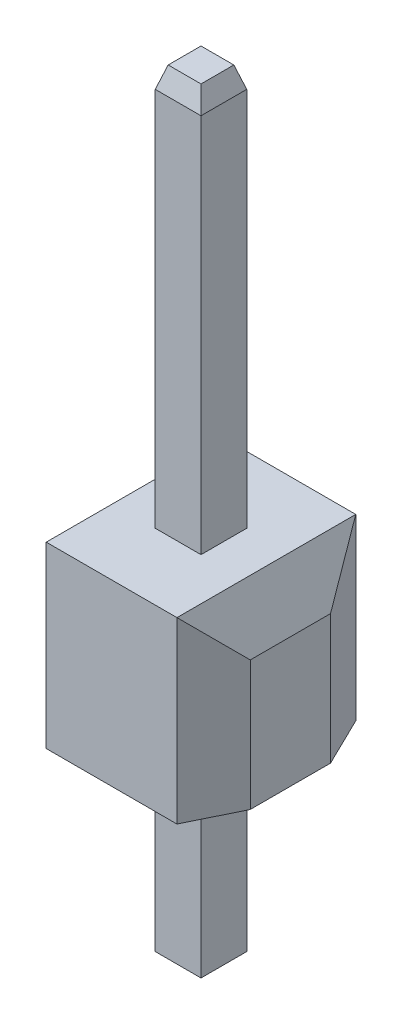
ISO-10303-21;
HEADER;
FILE_DESCRIPTION(('STEP AP214'),'2;1');
FILE_NAME('part.step','',(''),(''),'','','');
FILE_SCHEMA(('AUTOMOTIVE_DESIGN { 1 0 10303 214 1 1 1 1 }'));
ENDSEC;
DATA;
#1=APPLICATION_CONTEXT('core data for automotive mechanical design processes');
#2=APPLICATION_PROTOCOL_DEFINITION('international standard','automotive_design',2000,#1);
#3=PRODUCT_CONTEXT('',#1,'mechanical');
#4=PRODUCT('Part','Part','',(#3));
#5=PRODUCT_RELATED_PRODUCT_CATEGORY('part','',(#4));
#6=PRODUCT_DEFINITION_FORMATION('','',#4);
#7=PRODUCT_DEFINITION_CONTEXT('part definition',#1,'design');
#8=PRODUCT_DEFINITION('design','',#6,#7);
#9=PRODUCT_DEFINITION_SHAPE('','',#8);
#10=(LENGTH_UNIT() NAMED_UNIT(*) SI_UNIT(.MILLI.,.METRE.));
#11=(NAMED_UNIT(*) PLANE_ANGLE_UNIT() SI_UNIT($,.RADIAN.));
#12=(NAMED_UNIT(*) SI_UNIT($,.STERADIAN.) SOLID_ANGLE_UNIT());
#13=UNCERTAINTY_MEASURE_WITH_UNIT(LENGTH_MEASURE(1.E-05),#10,'distance_accuracy_value','');
#14=(GEOMETRIC_REPRESENTATION_CONTEXT(3) GLOBAL_UNCERTAINTY_ASSIGNED_CONTEXT((#13)) GLOBAL_UNIT_ASSIGNED_CONTEXT((#10,
#11,#12)) REPRESENTATION_CONTEXT('',''));
#15=CARTESIAN_POINT('',(0.,0.,0.));
#16=DIRECTION('',(0.,0.,1.));
#17=DIRECTION('',(1.,0.,0.));
#18=AXIS2_PLACEMENT_3D('',#15,#16,#17);
#19=CARTESIAN_POINT('',(0.,8.24,-0.233280795562401));
#20=DIRECTION('',(0.,-0.292371704722734,0.956304755963036));
#21=DIRECTION('',(0.,-0.956304755963036,-0.292371704722734));
#22=AXIS2_PLACEMENT_3D('',#19,#20,#21);
#23=PLANE('',#22);
#24=DIRECTION('',(-1.,0.,0.));
#25=VECTOR('',#24,1.);
#26=CARTESIAN_POINT('',(0.325,7.94,-0.325));
#27=LINE('',#26,#25);
#28=CARTESIAN_POINT('',(-0.325,7.94,-0.325));
#29=VERTEX_POINT('',#28);
#30=CARTESIAN_POINT('',(0.325,7.94,-0.325));
#31=VERTEX_POINT('',#30);
#32=EDGE_CURVE('E177',#29,#31,#27,.F.);
#33=ORIENTED_EDGE('',*,*,#32,.F.);
#34=DIRECTION('',(0.280623595142125,0.917878420979062,0.280623595142126));
#35=VECTOR('',#34,1.);
#36=CARTESIAN_POINT('',(-0.325,7.94,-0.325));
#37=LINE('',#36,#35);
#38=CARTESIAN_POINT('',(-0.233280795562401,8.24,-0.233280795562401));
#39=VERTEX_POINT('',#38);
#40=EDGE_CURVE('E152',#29,#39,#37,.T.);
#41=ORIENTED_EDGE('',*,*,#40,.T.);
#42=DIRECTION('',(1.,0.,0.));
#43=VECTOR('',#42,1.);
#44=CARTESIAN_POINT('',(0.,8.24,-0.233280795562401));
#45=LINE('',#44,#43);
#46=CARTESIAN_POINT('',(0.233280795562401,8.24,-0.233280795562401));
#47=VERTEX_POINT('',#46);
#48=EDGE_CURVE('E20',#47,#39,#45,.F.);
#49=ORIENTED_EDGE('',*,*,#48,.F.);
#50=DIRECTION('',(0.280623595142125,-0.917878420979062,-0.280623595142126));
#51=VECTOR('',#50,1.);
#52=CARTESIAN_POINT('',(0.233280795562401,8.24,-0.233280795562401));
#53=LINE('',#52,#51);
#54=EDGE_CURVE('E156',#47,#31,#53,.T.);
#55=ORIENTED_EDGE('',*,*,#54,.T.);
#56=EDGE_LOOP('',(#33,#41,#49,#55));
#57=FACE_BOUND('',#56,.T.);
#58=ADVANCED_FACE('F17',(#57),#23,.F.);
#59=CARTESIAN_POINT('',(0.,8.24,0.));
#60=DIRECTION('',(0.,1.,0.));
#61=DIRECTION('',(0.,0.,1.));
#62=AXIS2_PLACEMENT_3D('',#59,#60,#61);
#63=PLANE('',#62);
#64=DIRECTION('',(0.,0.,1.));
#65=VECTOR('',#64,1.);
#66=CARTESIAN_POINT('',(-0.233280795562401,8.24,0.));
#67=LINE('',#66,#65);
#68=CARTESIAN_POINT('',(-0.233280795562401,8.24,0.233280795562401));
#69=VERTEX_POINT('',#68);
#70=EDGE_CURVE('E173',#39,#69,#67,.T.);
#71=ORIENTED_EDGE('',*,*,#70,.T.);
#72=DIRECTION('',(1.,0.,0.));
#73=VECTOR('',#72,1.);
#74=CARTESIAN_POINT('',(0.,8.24,0.233280795562401));
#75=LINE('',#74,#73);
#76=CARTESIAN_POINT('',(0.233280795562401,8.24,0.233280795562401));
#77=VERTEX_POINT('',#76);
#78=EDGE_CURVE('E164',#69,#77,#75,.T.);
#79=ORIENTED_EDGE('',*,*,#78,.T.);
#80=DIRECTION('',(0.,0.,1.));
#81=VECTOR('',#80,1.);
#82=CARTESIAN_POINT('',(0.233280795562401,8.24,0.));
#83=LINE('',#82,#81);
#84=EDGE_CURVE('E160',#77,#47,#83,.F.);
#85=ORIENTED_EDGE('',*,*,#84,.T.);
#86=ORIENTED_EDGE('',*,*,#48,.T.);
#87=EDGE_LOOP('',(#71,#79,#85,#86));
#88=FACE_BOUND('',#87,.T.);
#89=ADVANCED_FACE('F162',(#88),#63,.T.);
#90=CARTESIAN_POINT('',(0.233280795562401,8.24,0.));
#91=DIRECTION('',(-0.956304755963036,-0.292371704722734,0.));
#92=DIRECTION('',(0.292371704722734,-0.956304755963036,0.));
#93=AXIS2_PLACEMENT_3D('',#90,#91,#92);
#94=PLANE('',#93);
#95=DIRECTION('',(0.,0.,-1.));
#96=VECTOR('',#95,1.);
#97=CARTESIAN_POINT('',(0.325,7.94,0.325));
#98=LINE('',#97,#96);
#99=CARTESIAN_POINT('',(0.325,7.94,0.325));
#100=VERTEX_POINT('',#99);
#101=EDGE_CURVE('E170',#31,#100,#98,.F.);
#102=ORIENTED_EDGE('',*,*,#101,.F.);
#103=ORIENTED_EDGE('',*,*,#54,.F.);
#104=ORIENTED_EDGE('',*,*,#84,.F.);
#105=DIRECTION('',(0.280623595142126,-0.917878420979062,0.280623595142125));
#106=VECTOR('',#105,1.);
#107=CARTESIAN_POINT('',(0.233280795562401,8.24,0.233280795562401));
#108=LINE('',#107,#106);
#109=EDGE_CURVE('E188',#77,#100,#108,.T.);
#110=ORIENTED_EDGE('',*,*,#109,.T.);
#111=EDGE_LOOP('',(#102,#103,#104,#110));
#112=FACE_BOUND('',#111,.T.);
#113=ADVANCED_FACE('F168',(#112),#94,.F.);
#114=CARTESIAN_POINT('',(-0.233280795562401,8.24,0.));
#115=DIRECTION('',(0.956304755963036,-0.292371704722734,0.));
#116=DIRECTION('',(0.292371704722734,0.956304755963036,0.));
#117=AXIS2_PLACEMENT_3D('',#114,#115,#116);
#118=PLANE('',#117);
#119=ORIENTED_EDGE('',*,*,#70,.F.);
#120=ORIENTED_EDGE('',*,*,#40,.F.);
#121=DIRECTION('',(0.,0.,1.));
#122=VECTOR('',#121,1.);
#123=CARTESIAN_POINT('',(-0.325,7.94,0.325));
#124=LINE('',#123,#122);
#125=CARTESIAN_POINT('',(-0.325,7.94,0.325));
#126=VERTEX_POINT('',#125);
#127=EDGE_CURVE('E193',#126,#29,#124,.F.);
#128=ORIENTED_EDGE('',*,*,#127,.F.);
#129=DIRECTION('',(0.280623595142126,0.917878420979062,-0.280623595142126));
#130=VECTOR('',#129,1.);
#131=CARTESIAN_POINT('',(-0.325,7.94,0.325));
#132=LINE('',#131,#130);
#133=EDGE_CURVE('E190',#126,#69,#132,.T.);
#134=ORIENTED_EDGE('',*,*,#133,.T.);
#135=EDGE_LOOP('',(#119,#120,#128,#134));
#136=FACE_BOUND('',#135,.T.);
#137=ADVANCED_FACE('F629',(#136),#118,.F.);
#138=CARTESIAN_POINT('',(0.325,-2.76,-0.325));
#139=DIRECTION('',(0.,0.,-1.));
#140=DIRECTION('',(-1.,0.,0.));
#141=AXIS2_PLACEMENT_3D('',#138,#139,#140);
#142=PLANE('',#141);
#143=DIRECTION('',(0.,1.,0.));
#144=VECTOR('',#143,1.);
#145=CARTESIAN_POINT('',(0.325,-2.76,-0.325));
#146=LINE('',#145,#144);
#147=CARTESIAN_POINT('',(0.325,2.54,-0.325));
#148=VERTEX_POINT('',#147);
#149=EDGE_CURVE('E181',#148,#31,#146,.T.);
#150=ORIENTED_EDGE('',*,*,#149,.F.);
#151=DIRECTION('',(-1.,0.,0.));
#152=VECTOR('',#151,1.);
#153=CARTESIAN_POINT('',(0.325,2.54,-0.325));
#154=LINE('',#153,#152);
#155=CARTESIAN_POINT('',(-0.325,2.54,-0.325));
#156=VERTEX_POINT('',#155);
#157=EDGE_CURVE('E179',#148,#156,#154,.T.);
#158=ORIENTED_EDGE('',*,*,#157,.T.);
#159=DIRECTION('',(0.,1.,0.));
#160=VECTOR('',#159,1.);
#161=CARTESIAN_POINT('',(-0.325,-2.76,-0.325));
#162=LINE('',#161,#160);
#163=EDGE_CURVE('E196',#29,#156,#162,.F.);
#164=ORIENTED_EDGE('',*,*,#163,.F.);
#165=ORIENTED_EDGE('',*,*,#32,.T.);
#166=EDGE_LOOP('',(#150,#158,#164,#165));
#167=FACE_BOUND('',#166,.T.);
#168=ADVANCED_FACE('F619',(#167),#142,.T.);
#169=CARTESIAN_POINT('',(0.325,-2.6682807955624,0.325));
#170=DIRECTION('',(0.,-0.956304755963036,0.292371704722736));
#171=DIRECTION('',(0.,-0.292371704722736,-0.956304755963036));
#172=AXIS2_PLACEMENT_3D('',#169,#170,#171);
#173=PLANE('',#172);
#174=DIRECTION('',(-0.69114074934468,-0.211302932280998,-0.69114074934468));
#175=VECTOR('',#174,1.);
#176=CARTESIAN_POINT('',(0.325,-2.6682807955624,0.325));
#177=LINE('',#176,#175);
#178=CARTESIAN_POINT('',(0.325,-2.6682807955624,0.325));
#179=VERTEX_POINT('',#178);
#180=CARTESIAN_POINT('',(0.0249999999999966,-2.76,0.0249999999999966));
#181=VERTEX_POINT('',#180);
#182=EDGE_CURVE('E201',#179,#181,#177,.T.);
#183=ORIENTED_EDGE('',*,*,#182,.F.);
#184=DIRECTION('',(1.,0.,0.));
#185=VECTOR('',#184,1.);
#186=CARTESIAN_POINT('',(0.325,-2.6682807955624,0.325));
#187=LINE('',#186,#185);
#188=CARTESIAN_POINT('',(-0.325,-2.6682807955624,0.325));
#189=VERTEX_POINT('',#188);
#190=EDGE_CURVE('E214',#189,#179,#187,.T.);
#191=ORIENTED_EDGE('',*,*,#190,.F.);
#192=DIRECTION('',(-0.69114074934468,0.211302932280998,0.69114074934468));
#193=VECTOR('',#192,1.);
#194=CARTESIAN_POINT('',(-0.0249999999999965,-2.76,0.0249999999999966));
#195=LINE('',#194,#193);
#196=CARTESIAN_POINT('',(-0.0249999999999967,-2.76,0.0249999999999967));
#197=VERTEX_POINT('',#196);
#198=EDGE_CURVE('E211',#197,#189,#195,.T.);
#199=ORIENTED_EDGE('',*,*,#198,.F.);
#200=DIRECTION('',(1.,0.,0.));
#201=VECTOR('',#200,1.);
#202=CARTESIAN_POINT('',(0.,-2.76,0.0249999999999966));
#203=LINE('',#202,#201);
#204=EDGE_CURVE('E204',#197,#181,#203,.T.);
#205=ORIENTED_EDGE('',*,*,#204,.T.);
#206=EDGE_LOOP('',(#183,#191,#199,#205));
#207=FACE_BOUND('',#206,.T.);
#208=ADVANCED_FACE('F609',(#207),#173,.T.);
#209=CARTESIAN_POINT('',(0.325,-2.76,0.325));
#210=DIRECTION('',(1.,0.,0.));
#211=DIRECTION('',(0.,0.,-1.));
#212=AXIS2_PLACEMENT_3D('',#209,#210,#211);
#213=PLANE('',#212);
#214=DIRECTION('',(0.,1.,0.));
#215=VECTOR('',#214,1.);
#216=CARTESIAN_POINT('',(0.325,-2.76,0.325));
#217=LINE('',#216,#215);
#218=CARTESIAN_POINT('',(0.325,2.54,0.325));
#219=VERTEX_POINT('',#218);
#220=EDGE_CURVE('E223',#219,#100,#217,.T.);
#221=ORIENTED_EDGE('',*,*,#220,.F.);
#222=DIRECTION('',(0.,0.,-1.));
#223=VECTOR('',#222,1.);
#224=CARTESIAN_POINT('',(0.325,2.54,0.325));
#225=LINE('',#224,#223);
#226=EDGE_CURVE('E184',#219,#148,#225,.T.);
#227=ORIENTED_EDGE('',*,*,#226,.T.);
#228=ORIENTED_EDGE('',*,*,#149,.T.);
#229=ORIENTED_EDGE('',*,*,#101,.T.);
#230=EDGE_LOOP('',(#221,#227,#228,#229));
#231=FACE_BOUND('',#230,.T.);
#232=ADVANCED_FACE('F599',(#231),#213,.T.);
#233=CARTESIAN_POINT('',(0.,8.24,0.233280795562401));
#234=DIRECTION('',(0.,-0.292371704722734,-0.956304755963036));
#235=DIRECTION('',(0.,0.956304755963036,-0.292371704722734));
#236=AXIS2_PLACEMENT_3D('',#233,#234,#235);
#237=PLANE('',#236);
#238=DIRECTION('',(1.,0.,0.));
#239=VECTOR('',#238,1.);
#240=CARTESIAN_POINT('',(0.325,7.94,0.325));
#241=LINE('',#240,#239);
#242=EDGE_CURVE('E226',#100,#126,#241,.F.);
#243=ORIENTED_EDGE('',*,*,#242,.F.);
#244=ORIENTED_EDGE('',*,*,#109,.F.);
#245=ORIENTED_EDGE('',*,*,#78,.F.);
#246=ORIENTED_EDGE('',*,*,#133,.F.);
#247=EDGE_LOOP('',(#243,#244,#245,#246));
#248=FACE_BOUND('',#247,.T.);
#249=ADVANCED_FACE('F589',(#248),#237,.F.);
#250=CARTESIAN_POINT('',(-0.325,-2.76,0.325));
#251=DIRECTION('',(-1.,0.,0.));
#252=DIRECTION('',(0.,0.,1.));
#253=AXIS2_PLACEMENT_3D('',#250,#251,#252);
#254=PLANE('',#253);
#255=ORIENTED_EDGE('',*,*,#163,.T.);
#256=DIRECTION('',(0.,0.,1.));
#257=VECTOR('',#256,1.);
#258=CARTESIAN_POINT('',(-0.325,2.54,0.325));
#259=LINE('',#258,#257);
#260=CARTESIAN_POINT('',(-0.325,2.54,0.325));
#261=VERTEX_POINT('',#260);
#262=EDGE_CURVE('E199',#156,#261,#259,.T.);
#263=ORIENTED_EDGE('',*,*,#262,.T.);
#264=DIRECTION('',(0.,1.,0.));
#265=VECTOR('',#264,1.);
#266=CARTESIAN_POINT('',(-0.325,-2.76,0.325));
#267=LINE('',#266,#265);
#268=EDGE_CURVE('E229',#126,#261,#267,.F.);
#269=ORIENTED_EDGE('',*,*,#268,.F.);
#270=ORIENTED_EDGE('',*,*,#127,.T.);
#271=EDGE_LOOP('',(#255,#263,#269,#270));
#272=FACE_BOUND('',#271,.T.);
#273=ADVANCED_FACE('F579',(#272),#254,.T.);
#274=CARTESIAN_POINT('',(0.325,-2.6682807955624,0.325));
#275=DIRECTION('',(0.292371704722736,-0.956304755963036,0.));
#276=DIRECTION('',(0.956304755963036,0.292371704722736,0.));
#277=AXIS2_PLACEMENT_3D('',#274,#275,#276);
#278=PLANE('',#277);
#279=DIRECTION('',(-0.69114074934468,-0.211302932280998,0.69114074934468));
#280=VECTOR('',#279,1.);
#281=CARTESIAN_POINT('',(0.325,-2.6682807955624,-0.325));
#282=LINE('',#281,#280);
#283=CARTESIAN_POINT('',(0.325,-2.6682807955624,-0.325));
#284=VERTEX_POINT('',#283);
#285=CARTESIAN_POINT('',(0.0249999999999966,-2.76,-0.0249999999999967));
#286=VERTEX_POINT('',#285);
#287=EDGE_CURVE('E248',#284,#286,#282,.T.);
#288=ORIENTED_EDGE('',*,*,#287,.F.);
#289=DIRECTION('',(0.,0.,-1.));
#290=VECTOR('',#289,1.);
#291=CARTESIAN_POINT('',(0.325,-2.6682807955624,0.325));
#292=LINE('',#291,#290);
#293=EDGE_CURVE('E239',#179,#284,#292,.T.);
#294=ORIENTED_EDGE('',*,*,#293,.F.);
#295=ORIENTED_EDGE('',*,*,#182,.T.);
#296=DIRECTION('',(0.,0.,1.));
#297=VECTOR('',#296,1.);
#298=CARTESIAN_POINT('',(0.0249999999999966,-2.76,0.));
#299=LINE('',#298,#297);
#300=EDGE_CURVE('E206',#181,#286,#299,.F.);
#301=ORIENTED_EDGE('',*,*,#300,.T.);
#302=EDGE_LOOP('',(#288,#294,#295,#301));
#303=FACE_BOUND('',#302,.T.);
#304=ADVANCED_FACE('F569',(#303),#278,.T.);
#305=CARTESIAN_POINT('',(0.,-2.76,0.));
#306=DIRECTION('',(0.,1.,0.));
#307=DIRECTION('',(0.,0.,1.));
#308=AXIS2_PLACEMENT_3D('',#305,#306,#307);
#309=PLANE('',#308);
#310=ORIENTED_EDGE('',*,*,#300,.F.);
#311=ORIENTED_EDGE('',*,*,#204,.F.);
#312=DIRECTION('',(0.,0.,1.));
#313=VECTOR('',#312,1.);
#314=CARTESIAN_POINT('',(-0.0249999999999965,-2.76,0.325));
#315=LINE('',#314,#313);
#316=CARTESIAN_POINT('',(-0.0249999999999966,-2.76,-0.0249999999999966));
#317=VERTEX_POINT('',#316);
#318=EDGE_CURVE('E208',#317,#197,#315,.T.);
#319=ORIENTED_EDGE('',*,*,#318,.F.);
#320=DIRECTION('',(1.,0.,0.));
#321=VECTOR('',#320,1.);
#322=CARTESIAN_POINT('',(0.325,-2.76,-0.0249999999999965));
#323=LINE('',#322,#321);
#324=EDGE_CURVE('E251',#286,#317,#323,.F.);
#325=ORIENTED_EDGE('',*,*,#324,.F.);
#326=EDGE_LOOP('',(#310,#311,#319,#325));
#327=FACE_BOUND('',#326,.T.);
#328=ADVANCED_FACE('F559',(#327),#309,.F.);
#329=CARTESIAN_POINT('',(-0.325,-2.6682807955624,0.325));
#330=DIRECTION('',(-0.292371704722736,-0.956304755963036,0.));
#331=DIRECTION('',(0.956304755963036,-0.292371704722736,0.));
#332=AXIS2_PLACEMENT_3D('',#329,#330,#331);
#333=PLANE('',#332);
#334=ORIENTED_EDGE('',*,*,#198,.T.);
#335=DIRECTION('',(0.,0.,1.));
#336=VECTOR('',#335,1.);
#337=CARTESIAN_POINT('',(-0.325,-2.6682807955624,0.325));
#338=LINE('',#337,#336);
#339=CARTESIAN_POINT('',(-0.325,-2.6682807955624,-0.325));
#340=VERTEX_POINT('',#339);
#341=EDGE_CURVE('E254',#340,#189,#338,.T.);
#342=ORIENTED_EDGE('',*,*,#341,.F.);
#343=DIRECTION('',(-0.691140749344681,0.211302932280998,-0.69114074934468));
#344=VECTOR('',#343,1.);
#345=CARTESIAN_POINT('',(-0.0249999999999966,-2.76,-0.0249999999999965));
#346=LINE('',#345,#344);
#347=EDGE_CURVE('E245',#317,#340,#346,.T.);
#348=ORIENTED_EDGE('',*,*,#347,.F.);
#349=ORIENTED_EDGE('',*,*,#318,.T.);
#350=EDGE_LOOP('',(#334,#342,#348,#349));
#351=FACE_BOUND('',#350,.T.);
#352=ADVANCED_FACE('F549',(#351),#333,.T.);
#353=CARTESIAN_POINT('',(0.325,-2.76,0.325));
#354=DIRECTION('',(0.,0.,1.));
#355=DIRECTION('',(1.,0.,0.));
#356=AXIS2_PLACEMENT_3D('',#353,#354,#355);
#357=PLANE('',#356);
#358=DIRECTION('',(0.,1.,0.));
#359=VECTOR('',#358,1.);
#360=CARTESIAN_POINT('',(0.325,-2.76,0.325));
#361=LINE('',#360,#359);
#362=CARTESIAN_POINT('',(0.325,0.,0.325));
#363=VERTEX_POINT('',#362);
#364=EDGE_CURVE('E236',#363,#179,#361,.F.);
#365=ORIENTED_EDGE('',*,*,#364,.F.);
#366=DIRECTION('',(1.,0.,0.));
#367=VECTOR('',#366,1.);
#368=CARTESIAN_POINT('',(0.325,0.,0.325));
#369=LINE('',#368,#367);
#370=CARTESIAN_POINT('',(-0.325,0.,0.325));
#371=VERTEX_POINT('',#370);
#372=EDGE_CURVE('E217',#363,#371,#369,.F.);
#373=ORIENTED_EDGE('',*,*,#372,.T.);
#374=DIRECTION('',(0.,1.,0.));
#375=VECTOR('',#374,1.);
#376=CARTESIAN_POINT('',(-0.325,-2.76,0.325));
#377=LINE('',#376,#375);
#378=EDGE_CURVE('E257',#189,#371,#377,.T.);
#379=ORIENTED_EDGE('',*,*,#378,.F.);
#380=ORIENTED_EDGE('',*,*,#190,.T.);
#381=EDGE_LOOP('',(#365,#373,#379,#380));
#382=FACE_BOUND('',#381,.T.);
#383=ADVANCED_FACE('F540',(#382),#357,.T.);
#384=CARTESIAN_POINT('',(1.27,2.54,1.27));
#385=DIRECTION('',(-1.,0.,0.));
#386=DIRECTION('',(0.,0.,1.));
#387=AXIS2_PLACEMENT_3D('',#384,#385,#386);
#388=PLANE('',#387);
#389=DIRECTION('',(0.,1.,0.));
#390=VECTOR('',#389,1.);
#391=CARTESIAN_POINT('',(1.27,2.54,-0.569999999999994));
#392=LINE('',#391,#390);
#393=CARTESIAN_POINT('',(1.27,0.,-0.569999999999994));
#394=VERTEX_POINT('',#393);
#395=CARTESIAN_POINT('',(1.27,1.83999999999999,-0.569999999999994));
#396=VERTEX_POINT('',#395);
#397=EDGE_CURVE('E264',#394,#396,#392,.T.);
#398=ORIENTED_EDGE('',*,*,#397,.T.);
#399=DIRECTION('',(0.,0.,1.));
#400=VECTOR('',#399,1.);
#401=CARTESIAN_POINT('',(1.27,1.83999999999999,0.));
#402=LINE('',#401,#400);
#403=CARTESIAN_POINT('',(1.27,1.83999999999999,0.569999999999994));
#404=VERTEX_POINT('',#403);
#405=EDGE_CURVE('E232',#396,#404,#402,.T.);
#406=ORIENTED_EDGE('',*,*,#405,.T.);
#407=DIRECTION('',(0.,1.,0.));
#408=VECTOR('',#407,1.);
#409=CARTESIAN_POINT('',(1.27,2.54,0.569999999999994));
#410=LINE('',#409,#408);
#411=CARTESIAN_POINT('',(1.27,0.,0.569999999999994));
#412=VERTEX_POINT('',#411);
#413=EDGE_CURVE('E279',#404,#412,#410,.F.);
#414=ORIENTED_EDGE('',*,*,#413,.T.);
#415=DIRECTION('',(0.,0.,1.));
#416=VECTOR('',#415,1.);
#417=CARTESIAN_POINT('',(1.27,0.,1.27));
#418=LINE('',#417,#416);
#419=EDGE_CURVE('E219',#394,#412,#418,.T.);
#420=ORIENTED_EDGE('',*,*,#419,.F.);
#421=EDGE_LOOP('',(#398,#406,#414,#420));
#422=FACE_BOUND('',#421,.T.);
#423=ADVANCED_FACE('F359',(#422),#388,.F.);
#424=CARTESIAN_POINT('',(-1.27,2.54,1.27));
#425=DIRECTION('',(1.,0.,0.));
#426=DIRECTION('',(0.,0.,-1.));
#427=AXIS2_PLACEMENT_3D('',#424,#425,#426);
#428=PLANE('',#427);
#429=DIRECTION('',(0.,1.,0.));
#430=VECTOR('',#429,1.);
#431=CARTESIAN_POINT('',(-1.27,2.54,-0.569999999999994));
#432=LINE('',#431,#430);
#433=CARTESIAN_POINT('',(-1.27,1.83999999999999,-0.569999999999994));
#434=VERTEX_POINT('',#433);
#435=CARTESIAN_POINT('',(-1.27,0.,-0.569999999999994));
#436=VERTEX_POINT('',#435);
#437=EDGE_CURVE('E268',#434,#436,#432,.F.);
#438=ORIENTED_EDGE('',*,*,#437,.T.);
#439=DIRECTION('',(0.,0.,-1.));
#440=VECTOR('',#439,1.);
#441=CARTESIAN_POINT('',(-1.27,0.,1.27));
#442=LINE('',#441,#440);
#443=CARTESIAN_POINT('',(-1.27,0.,0.569999999999994));
#444=VERTEX_POINT('',#443);
#445=EDGE_CURVE('E221',#444,#436,#442,.T.);
#446=ORIENTED_EDGE('',*,*,#445,.F.);
#447=DIRECTION('',(0.,1.,0.));
#448=VECTOR('',#447,1.);
#449=CARTESIAN_POINT('',(-1.27,2.54,0.569999999999994));
#450=LINE('',#449,#448);
#451=CARTESIAN_POINT('',(-1.27,1.83999999999999,0.569999999999994));
#452=VERTEX_POINT('',#451);
#453=EDGE_CURVE('E284',#444,#452,#450,.T.);
#454=ORIENTED_EDGE('',*,*,#453,.T.);
#455=DIRECTION('',(0.,0.,1.));
#456=VECTOR('',#455,1.);
#457=CARTESIAN_POINT('',(-1.27,1.83999999999999,0.));
#458=LINE('',#457,#456);
#459=EDGE_CURVE('E234',#452,#434,#458,.F.);
#460=ORIENTED_EDGE('',*,*,#459,.T.);
#461=EDGE_LOOP('',(#438,#446,#454,#460));
#462=FACE_BOUND('',#461,.T.);
#463=ADVANCED_FACE('F369',(#462),#428,.F.);
#464=CARTESIAN_POINT('',(0.325,-2.76,0.325));
#465=DIRECTION('',(0.,0.,1.));
#466=DIRECTION('',(1.,0.,0.));
#467=AXIS2_PLACEMENT_3D('',#464,#465,#466);
#468=PLANE('',#467);
#469=ORIENTED_EDGE('',*,*,#268,.T.);
#470=DIRECTION('',(1.,0.,0.));
#471=VECTOR('',#470,1.);
#472=CARTESIAN_POINT('',(0.,2.54,0.325));
#473=LINE('',#472,#471);
#474=EDGE_CURVE('E289',#261,#219,#473,.T.);
#475=ORIENTED_EDGE('',*,*,#474,.T.);
#476=ORIENTED_EDGE('',*,*,#220,.T.);
#477=ORIENTED_EDGE('',*,*,#242,.T.);
#478=EDGE_LOOP('',(#469,#475,#476,#477));
#479=FACE_BOUND('',#478,.T.);
#480=ADVANCED_FACE('F514',(#479),#468,.T.);
#481=CARTESIAN_POINT('',(0.928587188003896,2.54,0.));
#482=DIRECTION('',(-0.898794046299168,-0.438371146789076,0.));
#483=DIRECTION('',(0.438371146789076,-0.898794046299168,0.));
#484=AXIS2_PLACEMENT_3D('',#481,#482,#483);
#485=PLANE('',#484);
#486=ORIENTED_EDGE('',*,*,#405,.F.);
#487=DIRECTION('',(-0.326034139782525,0.668469049282115,-0.668469049282115));
#488=VECTOR('',#487,1.);
#489=CARTESIAN_POINT('',(1.27,1.83999999999999,-0.569999999999994));
#490=LINE('',#489,#488);
#491=CARTESIAN_POINT('',(0.928587188003896,2.54,-1.27));
#492=VERTEX_POINT('',#491);
#493=EDGE_CURVE('E266',#396,#492,#490,.T.);
#494=ORIENTED_EDGE('',*,*,#493,.T.);
#495=DIRECTION('',(0.,0.,-1.));
#496=VECTOR('',#495,1.);
#497=CARTESIAN_POINT('',(0.928587188003896,2.54,0.));
#498=LINE('',#497,#496);
#499=CARTESIAN_POINT('',(0.928587188003896,2.54,1.27));
#500=VERTEX_POINT('',#499);
#501=EDGE_CURVE('E292',#492,#500,#498,.F.);
#502=ORIENTED_EDGE('',*,*,#501,.T.);
#503=DIRECTION('',(0.326034139782525,-0.668469049282115,-0.668469049282115));
#504=VECTOR('',#503,1.);
#505=CARTESIAN_POINT('',(0.928587188003896,2.54,1.27));
#506=LINE('',#505,#504);
#507=EDGE_CURVE('E276',#500,#404,#506,.T.);
#508=ORIENTED_EDGE('',*,*,#507,.T.);
#509=EDGE_LOOP('',(#486,#494,#502,#508));
#510=FACE_BOUND('',#509,.T.);
#511=ADVANCED_FACE('F352',(#510),#485,.F.);
#512=CARTESIAN_POINT('',(-0.928587188003896,2.54,0.));
#513=DIRECTION('',(0.898794046299168,-0.438371146789076,0.));
#514=DIRECTION('',(0.438371146789076,0.898794046299168,0.));
#515=AXIS2_PLACEMENT_3D('',#512,#513,#514);
#516=PLANE('',#515);
#517=DIRECTION('',(0.,0.,-1.));
#518=VECTOR('',#517,1.);
#519=CARTESIAN_POINT('',(-0.928587188003896,2.54,0.));
#520=LINE('',#519,#518);
#521=CARTESIAN_POINT('',(-0.928587188003896,2.54,1.27));
#522=VERTEX_POINT('',#521);
#523=CARTESIAN_POINT('',(-0.928587188003896,2.54,-1.27));
#524=VERTEX_POINT('',#523);
#525=EDGE_CURVE('E294',#522,#524,#520,.T.);
#526=ORIENTED_EDGE('',*,*,#525,.T.);
#527=DIRECTION('',(-0.326034139782525,-0.668469049282115,0.668469049282115));
#528=VECTOR('',#527,1.);
#529=CARTESIAN_POINT('',(-0.928587188003896,2.54,-1.27));
#530=LINE('',#529,#528);
#531=EDGE_CURVE('E273',#524,#434,#530,.T.);
#532=ORIENTED_EDGE('',*,*,#531,.T.);
#533=ORIENTED_EDGE('',*,*,#459,.F.);
#534=DIRECTION('',(0.326034139782525,0.668469049282115,0.668469049282115));
#535=VECTOR('',#534,1.);
#536=CARTESIAN_POINT('',(-1.27,1.83999999999999,0.569999999999994));
#537=LINE('',#536,#535);
#538=EDGE_CURVE('E286',#452,#522,#537,.T.);
#539=ORIENTED_EDGE('',*,*,#538,.T.);
#540=EDGE_LOOP('',(#526,#532,#533,#539));
#541=FACE_BOUND('',#540,.T.);
#542=ADVANCED_FACE('F365',(#541),#516,.F.);
#543=CARTESIAN_POINT('',(0.325,-2.76,0.325));
#544=DIRECTION('',(1.,0.,0.));
#545=DIRECTION('',(0.,0.,-1.));
#546=AXIS2_PLACEMENT_3D('',#543,#544,#545);
#547=PLANE('',#546);
#548=DIRECTION('',(0.,1.,0.));
#549=VECTOR('',#548,1.);
#550=CARTESIAN_POINT('',(0.325,-2.76,-0.325));
#551=LINE('',#550,#549);
#552=CARTESIAN_POINT('',(0.325,0.,-0.325));
#553=VERTEX_POINT('',#552);
#554=EDGE_CURVE('E296',#553,#284,#551,.F.);
#555=ORIENTED_EDGE('',*,*,#554,.F.);
#556=DIRECTION('',(0.,0.,-1.));
#557=VECTOR('',#556,1.);
#558=CARTESIAN_POINT('',(0.325,0.,0.325));
#559=LINE('',#558,#557);
#560=EDGE_CURVE('E242',#553,#363,#559,.F.);
#561=ORIENTED_EDGE('',*,*,#560,.T.);
#562=ORIENTED_EDGE('',*,*,#364,.T.);
#563=ORIENTED_EDGE('',*,*,#293,.T.);
#564=EDGE_LOOP('',(#555,#561,#562,#563));
#565=FACE_BOUND('',#564,.T.);
#566=ADVANCED_FACE('F487',(#565),#547,.T.);
#567=CARTESIAN_POINT('',(0.325,-2.6682807955624,-0.325));
#568=DIRECTION('',(0.,-0.956304755963036,-0.292371704722736));
#569=DIRECTION('',(0.,0.292371704722736,-0.956304755963036));
#570=AXIS2_PLACEMENT_3D('',#567,#568,#569);
#571=PLANE('',#570);
#572=ORIENTED_EDGE('',*,*,#287,.T.);
#573=ORIENTED_EDGE('',*,*,#324,.T.);
#574=ORIENTED_EDGE('',*,*,#347,.T.);
#575=DIRECTION('',(-1.,0.,0.));
#576=VECTOR('',#575,1.);
#577=CARTESIAN_POINT('',(0.325,-2.6682807955624,-0.325));
#578=LINE('',#577,#576);
#579=EDGE_CURVE('E299',#284,#340,#578,.T.);
#580=ORIENTED_EDGE('',*,*,#579,.F.);
#581=EDGE_LOOP('',(#572,#573,#574,#580));
#582=FACE_BOUND('',#581,.T.);
#583=ADVANCED_FACE('F477',(#582),#571,.T.);
#584=CARTESIAN_POINT('',(-0.325,-2.76,0.325));
#585=DIRECTION('',(-1.,0.,0.));
#586=DIRECTION('',(0.,0.,1.));
#587=AXIS2_PLACEMENT_3D('',#584,#585,#586);
#588=PLANE('',#587);
#589=ORIENTED_EDGE('',*,*,#378,.T.);
#590=DIRECTION('',(0.,0.,1.));
#591=VECTOR('',#590,1.);
#592=CARTESIAN_POINT('',(-0.325,0.,0.325));
#593=LINE('',#592,#591);
#594=CARTESIAN_POINT('',(-0.325,0.,-0.325));
#595=VERTEX_POINT('',#594);
#596=EDGE_CURVE('E260',#371,#595,#593,.F.);
#597=ORIENTED_EDGE('',*,*,#596,.T.);
#598=DIRECTION('',(0.,1.,0.));
#599=VECTOR('',#598,1.);
#600=CARTESIAN_POINT('',(-0.325,-2.76,-0.325));
#601=LINE('',#600,#599);
#602=EDGE_CURVE('E302',#340,#595,#601,.T.);
#603=ORIENTED_EDGE('',*,*,#602,.F.);
#604=ORIENTED_EDGE('',*,*,#341,.T.);
#605=EDGE_LOOP('',(#589,#597,#603,#604));
#606=FACE_BOUND('',#605,.T.);
#607=ADVANCED_FACE('F380',(#606),#588,.T.);
#608=CARTESIAN_POINT('',(0.928587188003896,2.54,-1.27));
#609=DIRECTION('',(-0.898794046299168,0.,0.438371146789076));
#610=DIRECTION('',(0.438371146789076,0.,0.898794046299168));
#611=AXIS2_PLACEMENT_3D('',#608,#609,#610);
#612=PLANE('',#611);
#613=ORIENTED_EDGE('',*,*,#397,.F.);
#614=DIRECTION('',(0.438371146789076,0.,0.898794046299168));
#615=VECTOR('',#614,1.);
#616=CARTESIAN_POINT('',(0.928587188003896,0.,-1.27));
#617=LINE('',#616,#615);
#618=CARTESIAN_POINT('',(0.928587188003896,0.,-1.27));
#619=VERTEX_POINT('',#618);
#620=EDGE_CURVE('E262',#619,#394,#617,.T.);
#621=ORIENTED_EDGE('',*,*,#620,.F.);
#622=DIRECTION('',(0.,1.,0.));
#623=VECTOR('',#622,1.);
#624=CARTESIAN_POINT('',(0.928587188003896,2.54,-1.27));
#625=LINE('',#624,#623);
#626=EDGE_CURVE('E305',#619,#492,#625,.T.);
#627=ORIENTED_EDGE('',*,*,#626,.T.);
#628=ORIENTED_EDGE('',*,*,#493,.F.);
#629=EDGE_LOOP('',(#613,#621,#627,#628));
#630=FACE_BOUND('',#629,.T.);
#631=ADVANCED_FACE('F341',(#630),#612,.F.);
#632=CARTESIAN_POINT('',(-1.27,2.54,-0.569999999999994));
#633=DIRECTION('',(0.898794046299168,0.,0.438371146789076));
#634=DIRECTION('',(0.438371146789076,0.,-0.898794046299168));
#635=AXIS2_PLACEMENT_3D('',#632,#633,#634);
#636=PLANE('',#635);
#637=DIRECTION('',(0.,1.,0.));
#638=VECTOR('',#637,1.);
#639=CARTESIAN_POINT('',(-0.928587188003896,2.54,-1.27));
#640=LINE('',#639,#638);
#641=CARTESIAN_POINT('',(-0.928587188003896,0.,-1.27));
#642=VERTEX_POINT('',#641);
#643=EDGE_CURVE('E311',#524,#642,#640,.F.);
#644=ORIENTED_EDGE('',*,*,#643,.T.);
#645=DIRECTION('',(0.438371146789076,0.,-0.898794046299168));
#646=VECTOR('',#645,1.);
#647=CARTESIAN_POINT('',(-1.27,0.,-0.569999999999994));
#648=LINE('',#647,#646);
#649=EDGE_CURVE('E271',#436,#642,#648,.T.);
#650=ORIENTED_EDGE('',*,*,#649,.F.);
#651=ORIENTED_EDGE('',*,*,#437,.F.);
#652=ORIENTED_EDGE('',*,*,#531,.F.);
#653=EDGE_LOOP('',(#644,#650,#651,#652));
#654=FACE_BOUND('',#653,.T.);
#655=ADVANCED_FACE('F371',(#654),#636,.F.);
#656=CARTESIAN_POINT('',(1.27,2.54,0.569999999999994));
#657=DIRECTION('',(-0.898794046299168,0.,-0.438371146789076));
#658=DIRECTION('',(-0.438371146789076,0.,0.898794046299168));
#659=AXIS2_PLACEMENT_3D('',#656,#657,#658);
#660=PLANE('',#659);
#661=ORIENTED_EDGE('',*,*,#413,.F.);
#662=ORIENTED_EDGE('',*,*,#507,.F.);
#663=DIRECTION('',(0.,1.,0.));
#664=VECTOR('',#663,1.);
#665=CARTESIAN_POINT('',(0.928587188003896,2.54,1.27));
#666=LINE('',#665,#664);
#667=CARTESIAN_POINT('',(0.928587188003896,0.,1.27));
#668=VERTEX_POINT('',#667);
#669=EDGE_CURVE('E314',#500,#668,#666,.F.);
#670=ORIENTED_EDGE('',*,*,#669,.T.);
#671=DIRECTION('',(-0.438371146789076,0.,0.898794046299168));
#672=VECTOR('',#671,1.);
#673=CARTESIAN_POINT('',(1.27,0.,0.569999999999994));
#674=LINE('',#673,#672);
#675=EDGE_CURVE('E282',#412,#668,#674,.T.);
#676=ORIENTED_EDGE('',*,*,#675,.F.);
#677=EDGE_LOOP('',(#661,#662,#670,#676));
#678=FACE_BOUND('',#677,.T.);
#679=ADVANCED_FACE('F355',(#678),#660,.F.);
#680=CARTESIAN_POINT('',(-0.928587188003896,2.54,1.27));
#681=DIRECTION('',(0.898794046299168,0.,-0.438371146789076));
#682=DIRECTION('',(-0.438371146789076,0.,-0.898794046299168));
#683=AXIS2_PLACEMENT_3D('',#680,#681,#682);
#684=PLANE('',#683);
#685=DIRECTION('',(0.,1.,0.));
#686=VECTOR('',#685,1.);
#687=CARTESIAN_POINT('',(-0.928587188003896,2.54,1.27));
#688=LINE('',#687,#686);
#689=CARTESIAN_POINT('',(-0.928587188003896,0.,1.27));
#690=VERTEX_POINT('',#689);
#691=EDGE_CURVE('E317',#690,#522,#688,.T.);
#692=ORIENTED_EDGE('',*,*,#691,.T.);
#693=ORIENTED_EDGE('',*,*,#538,.F.);
#694=ORIENTED_EDGE('',*,*,#453,.F.);
#695=DIRECTION('',(-0.438371146789076,0.,-0.898794046299168));
#696=VECTOR('',#695,1.);
#697=CARTESIAN_POINT('',(-0.928587188003896,0.,1.27));
#698=LINE('',#697,#696);
#699=EDGE_CURVE('E35',#690,#444,#698,.T.);
#700=ORIENTED_EDGE('',*,*,#699,.F.);
#701=EDGE_LOOP('',(#692,#693,#694,#700));
#702=FACE_BOUND('',#701,.T.);
#703=ADVANCED_FACE('F363',(#702),#684,.F.);
#704=CARTESIAN_POINT('',(0.,2.54,0.));
#705=DIRECTION('',(0.,-1.,0.));
#706=DIRECTION('',(0.,0.,-1.));
#707=AXIS2_PLACEMENT_3D('',#704,#705,#706);
#708=PLANE('',#707);
#709=ORIENTED_EDGE('',*,*,#525,.F.);
#710=DIRECTION('',(-1.,0.,0.));
#711=VECTOR('',#710,1.);
#712=CARTESIAN_POINT('',(-1.27,2.54,1.27));
#713=LINE('',#712,#711);
#714=EDGE_CURVE('E319',#522,#500,#713,.F.);
#715=ORIENTED_EDGE('',*,*,#714,.T.);
#716=ORIENTED_EDGE('',*,*,#501,.F.);
#717=DIRECTION('',(1.,0.,0.));
#718=VECTOR('',#717,1.);
#719=CARTESIAN_POINT('',(-1.27,2.54,-1.27));
#720=LINE('',#719,#718);
#721=EDGE_CURVE('E308',#492,#524,#720,.F.);
#722=ORIENTED_EDGE('',*,*,#721,.T.);
#723=EDGE_LOOP('',(#709,#715,#716,#722));
#724=FACE_BOUND('',#723,.T.);
#725=ORIENTED_EDGE('',*,*,#262,.F.);
#726=ORIENTED_EDGE('',*,*,#157,.F.);
#727=ORIENTED_EDGE('',*,*,#226,.F.);
#728=ORIENTED_EDGE('',*,*,#474,.F.);
#729=EDGE_LOOP('',(#725,#726,#727,#728));
#730=FACE_BOUND('',#729,.T.);
#731=ADVANCED_FACE('F344',(#724,#730),#708,.F.);
#732=CARTESIAN_POINT('',(0.325,-2.76,-0.325));
#733=DIRECTION('',(0.,0.,-1.));
#734=DIRECTION('',(-1.,0.,0.));
#735=AXIS2_PLACEMENT_3D('',#732,#733,#734);
#736=PLANE('',#735);
#737=ORIENTED_EDGE('',*,*,#602,.T.);
#738=DIRECTION('',(1.,0.,0.));
#739=VECTOR('',#738,1.);
#740=CARTESIAN_POINT('',(0.,0.,-0.325));
#741=LINE('',#740,#739);
#742=EDGE_CURVE('E322',#553,#595,#741,.F.);
#743=ORIENTED_EDGE('',*,*,#742,.F.);
#744=ORIENTED_EDGE('',*,*,#554,.T.);
#745=ORIENTED_EDGE('',*,*,#579,.T.);
#746=EDGE_LOOP('',(#737,#743,#744,#745));
#747=FACE_BOUND('',#746,.T.);
#748=ADVANCED_FACE('F391',(#747),#736,.T.);
#749=CARTESIAN_POINT('',(-1.27,2.54,-1.27));
#750=DIRECTION('',(0.,0.,1.));
#751=DIRECTION('',(1.,0.,0.));
#752=AXIS2_PLACEMENT_3D('',#749,#750,#751);
#753=PLANE('',#752);
#754=ORIENTED_EDGE('',*,*,#643,.F.);
#755=ORIENTED_EDGE('',*,*,#721,.F.);
#756=ORIENTED_EDGE('',*,*,#626,.F.);
#757=DIRECTION('',(1.,0.,0.));
#758=VECTOR('',#757,1.);
#759=CARTESIAN_POINT('',(0.,0.,-1.27));
#760=LINE('',#759,#758);
#761=EDGE_CURVE('E26',#642,#619,#760,.T.);
#762=ORIENTED_EDGE('',*,*,#761,.F.);
#763=EDGE_LOOP('',(#754,#755,#756,#762));
#764=FACE_BOUND('',#763,.T.);
#765=ADVANCED_FACE('F335',(#764),#753,.F.);
#766=CARTESIAN_POINT('',(-1.27,2.54,1.27));
#767=DIRECTION('',(0.,0.,-1.));
#768=DIRECTION('',(-1.,0.,0.));
#769=AXIS2_PLACEMENT_3D('',#766,#767,#768);
#770=PLANE('',#769);
#771=ORIENTED_EDGE('',*,*,#691,.F.);
#772=DIRECTION('',(1.,0.,0.));
#773=VECTOR('',#772,1.);
#774=CARTESIAN_POINT('',(0.,0.,1.27));
#775=LINE('',#774,#773);
#776=EDGE_CURVE('E11',#668,#690,#775,.F.);
#777=ORIENTED_EDGE('',*,*,#776,.F.);
#778=ORIENTED_EDGE('',*,*,#669,.F.);
#779=ORIENTED_EDGE('',*,*,#714,.F.);
#780=EDGE_LOOP('',(#771,#777,#778,#779));
#781=FACE_BOUND('',#780,.T.);
#782=ADVANCED_FACE('F361',(#781),#770,.F.);
#783=CARTESIAN_POINT('',(0.,0.,0.));
#784=DIRECTION('',(0.,-1.,0.));
#785=DIRECTION('',(0.,0.,-1.));
#786=AXIS2_PLACEMENT_3D('',#783,#784,#785);
#787=PLANE('',#786);
#788=ORIENTED_EDGE('',*,*,#776,.T.);
#789=ORIENTED_EDGE('',*,*,#699,.T.);
#790=ORIENTED_EDGE('',*,*,#445,.T.);
#791=ORIENTED_EDGE('',*,*,#649,.T.);
#792=ORIENTED_EDGE('',*,*,#761,.T.);
#793=ORIENTED_EDGE('',*,*,#620,.T.);
#794=ORIENTED_EDGE('',*,*,#419,.T.);
#795=ORIENTED_EDGE('',*,*,#675,.T.);
#796=EDGE_LOOP('',(#788,#789,#790,#791,#792,#793,#794,#795));
#797=FACE_BOUND('',#796,.T.);
#798=ORIENTED_EDGE('',*,*,#560,.F.);
#799=ORIENTED_EDGE('',*,*,#742,.T.);
#800=ORIENTED_EDGE('',*,*,#596,.F.);
#801=ORIENTED_EDGE('',*,*,#372,.F.);
#802=EDGE_LOOP('',(#798,#799,#800,#801));
#803=FACE_BOUND('',#802,.T.);
#804=ADVANCED_FACE('F328',(#797,#803),#787,.T.);
#805=CLOSED_SHELL('',(#58,#89,#113,#137,#168,#208,#232,#249,#273,#304,#328,#352,#383,#423,#463,
#480,#511,#542,#566,#583,#607,#631,#655,#679,#703,#731,#748,#765,#782,#804));
#806=MANIFOLD_SOLID_BREP('B1',#805);
#807=ADVANCED_BREP_SHAPE_REPRESENTATION('',(#18,#806),#14);
#808=SHAPE_DEFINITION_REPRESENTATION(#9,#807);
ENDSEC;
END-ISO-10303-21;
